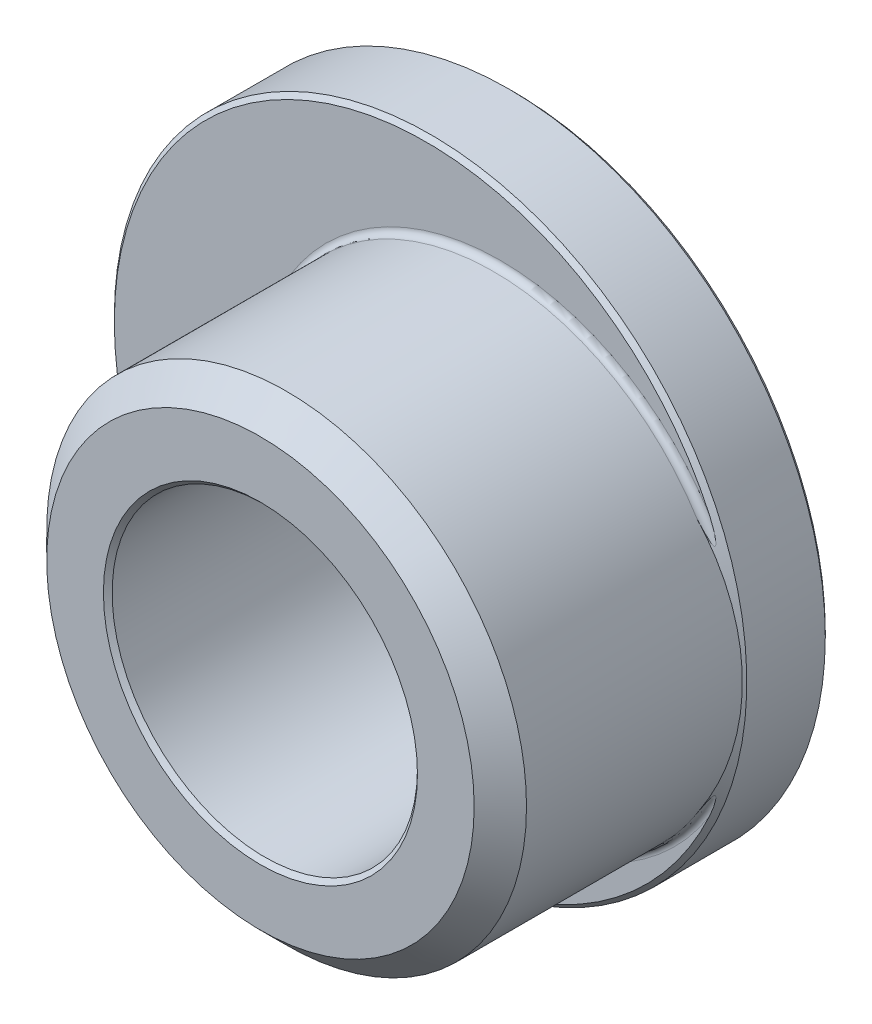
ISO-10303-21;
HEADER;
FILE_DESCRIPTION(('STEP AP214'),'2;1');
FILE_NAME('part.step','',(''),(''),'','','');
FILE_SCHEMA(('AUTOMOTIVE_DESIGN { 1 0 10303 214 1 1 1 1 }'));
ENDSEC;
DATA;
#1=APPLICATION_CONTEXT('core data for automotive mechanical design processes');
#2=APPLICATION_PROTOCOL_DEFINITION('international standard','automotive_design',2000,#1);
#3=PRODUCT_CONTEXT('',#1,'mechanical');
#4=PRODUCT('Part','Part','',(#3));
#5=PRODUCT_RELATED_PRODUCT_CATEGORY('part','',(#4));
#6=PRODUCT_DEFINITION_FORMATION('','',#4);
#7=PRODUCT_DEFINITION_CONTEXT('part definition',#1,'design');
#8=PRODUCT_DEFINITION('design','',#6,#7);
#9=PRODUCT_DEFINITION_SHAPE('','',#8);
#10=(LENGTH_UNIT() NAMED_UNIT(*) SI_UNIT(.MILLI.,.METRE.));
#11=(NAMED_UNIT(*) PLANE_ANGLE_UNIT() SI_UNIT($,.RADIAN.));
#12=(NAMED_UNIT(*) SI_UNIT($,.STERADIAN.) SOLID_ANGLE_UNIT());
#13=UNCERTAINTY_MEASURE_WITH_UNIT(LENGTH_MEASURE(1.E-05),#10,'distance_accuracy_value','');
#14=(GEOMETRIC_REPRESENTATION_CONTEXT(3) GLOBAL_UNCERTAINTY_ASSIGNED_CONTEXT((#13)) GLOBAL_UNIT_ASSIGNED_CONTEXT((#10,
#11,#12)) REPRESENTATION_CONTEXT('',''));
#15=CARTESIAN_POINT('',(0.,0.,0.));
#16=DIRECTION('',(0.,0.,1.));
#17=DIRECTION('',(1.,0.,0.));
#18=AXIS2_PLACEMENT_3D('',#15,#16,#17);
#19=CARTESIAN_POINT('',(0.,0.,15.));
#20=DIRECTION('',(0.,0.,-1.));
#21=DIRECTION('',(-1.,0.,0.));
#22=AXIS2_PLACEMENT_3D('',#19,#20,#21);
#23=CYLINDRICAL_SURFACE('',#22,11.);
#24=CARTESIAN_POINT('',(0.,0.,13.8));
#25=DIRECTION('',(0.,0.,1.));
#26=DIRECTION('',(1.,0.,0.));
#27=AXIS2_PLACEMENT_3D('',#24,#25,#26);
#28=CIRCLE('',#27,11.);
#29=CARTESIAN_POINT('',(11.,0.,13.8));
#30=VERTEX_POINT('',#29);
#31=EDGE_CURVE('E122',#30,#30,#28,.F.);
#32=ORIENTED_EDGE('',*,*,#31,.T.);
#33=EDGE_LOOP('',(#32));
#34=FACE_BOUND('',#33,.T.);
#35=CARTESIAN_POINT('',(9.32941176470587,-5.82769904203775,4.3));
#36=CARTESIAN_POINT('',(9.46506582073713,-5.61056829093484,4.26705682673574));
#37=CARTESIAN_POINT('',(9.59324175545103,-5.38847001269472,4.23604334911613));
#38=CARTESIAN_POINT('',(9.83395815540391,-4.93547805176798,4.17796866420182));
#39=CARTESIAN_POINT('',(9.94649963802059,-4.70458494263273,4.15090719973266));
#40=CARTESIAN_POINT('',(10.1554483381106,-4.2347488021077,4.1007861053484));
#41=CARTESIAN_POINT('',(10.2518301532776,-3.99579379298393,4.07773277398221));
#42=CARTESIAN_POINT('',(10.4276866232475,-3.51137517341966,4.03575413366546));
#43=CARTESIAN_POINT('',(10.5071599730125,-3.26591106223356,4.01682914334775));
#44=CARTESIAN_POINT('',(10.6604894029512,-2.72845736597818,3.98037309527567));
#45=CARTESIAN_POINT('',(10.7312152025437,-2.43551714425476,3.96359680956948));
#46=CARTESIAN_POINT('',(10.8484279736611,-1.84455299415052,3.93582571895308));
#47=CARTESIAN_POINT('',(10.8949136389636,-1.54652879270397,3.92483122560467));
#48=CARTESIAN_POINT('',(10.9632255312275,-0.947815240222858,3.90868319306648));
#49=CARTESIAN_POINT('',(10.9850774645402,-0.647128998113439,3.90352356492783));
#50=CARTESIAN_POINT('',(11.00403133485,-0.0450373079807727,3.89904808334799));
#51=CARTESIAN_POINT('',(11.0011394036638,0.256367943355817,3.89973078211041));
#52=CARTESIAN_POINT('',(10.9647573686512,0.973556078687331,3.90832236300149));
#53=CARTESIAN_POINT('',(10.9199354540887,1.3887806703639,3.91890744960831));
#54=CARTESIAN_POINT('',(10.7835693328883,2.21092487183266,3.95118365558871));
#55=CARTESIAN_POINT('',(10.6920400717163,2.61784709493619,3.97287122238608));
#56=CARTESIAN_POINT('',(10.5072755742107,3.26551710876524,4.01680184023284));
#57=CARTESIAN_POINT('',(10.4279527656208,3.51055648748244,4.03569080711425));
#58=CARTESIAN_POINT('',(10.2524313569832,3.99422282536746,4.07758905757447));
#59=CARTESIAN_POINT('',(10.1562304157966,4.23284888965255,4.10059891276435));
#60=CARTESIAN_POINT('',(9.94736196470939,4.7027861476769,4.1506999465701));
#61=CARTESIAN_POINT('',(9.83466860846366,4.93408515360107,4.17779753342846));
#62=CARTESIAN_POINT('',(9.59361949398408,5.3878149322342,4.23595194978899));
#63=CARTESIAN_POINT('',(9.46526589881345,5.61024692407713,4.2670082325246));
#64=CARTESIAN_POINT('',(9.32941176470585,5.82769904203778,4.3));
#65=B_SPLINE_CURVE_WITH_KNOTS('',3,(#35,#36,#37,#38,#39,#40,#41,#42,#43,#44,#45,#46,#47,#48,#49,
#50,#51,#52,#53,#54,#55,#56,#57,#58,#59,#60,#61,#62,#63,#64),.UNSPECIFIED.,.F.,.F.,(4,2,2,2,2,2,
2,2,2,2,2,2,2,2,4),(0.,0.774242365537738,1.54843432532694,2.32383209775523,3.09928969563251,
4.00366326217738,4.90808555745082,5.81156317321887,6.71481690323679,7.96519206531882,
9.21516738168663,9.98932262964853,10.7635853444687,11.5390747153358,12.3144570930991),.UNSPECIFIED.);
#66=CARTESIAN_POINT('',(9.32941176470587,-5.82769904203775,4.3));
#67=VERTEX_POINT('',#66);
#68=CARTESIAN_POINT('',(9.32941176470585,5.82769904203778,4.3));
#69=VERTEX_POINT('',#68);
#70=EDGE_CURVE('E52',#67,#69,#65,.T.);
#71=ORIENTED_EDGE('',*,*,#70,.T.);
#72=CARTESIAN_POINT('',(0.,0.,4.3));
#73=DIRECTION('',(0.,0.,-1.));
#74=DIRECTION('',(-1.,0.,0.));
#75=AXIS2_PLACEMENT_3D('',#72,#73,#74);
#76=CIRCLE('',#75,11.);
#77=EDGE_CURVE('E67',#69,#67,#76,.F.);
#78=ORIENTED_EDGE('',*,*,#77,.T.);
#79=EDGE_LOOP('',(#71,#78));
#80=FACE_BOUND('',#79,.T.);
#81=ADVANCED_FACE('F33',(#34,#80),#23,.T.);
#82=CARTESIAN_POINT('',(0.,0.,15.));
#83=DIRECTION('',(0.,0.,1.));
#84=DIRECTION('',(1.,0.,0.));
#85=AXIS2_PLACEMENT_3D('',#82,#83,#84);
#86=PLANE('',#85);
#87=CARTESIAN_POINT('',(0.,0.,15.));
#88=DIRECTION('',(0.,0.,1.));
#89=DIRECTION('',(1.,0.,0.));
#90=AXIS2_PLACEMENT_3D('',#87,#88,#89);
#91=CIRCLE('',#90,7.2);
#92=CARTESIAN_POINT('',(7.2,0.,15.));
#93=VERTEX_POINT('',#92);
#94=EDGE_CURVE('E80',#93,#93,#91,.F.);
#95=ORIENTED_EDGE('',*,*,#94,.T.);
#96=EDGE_LOOP('',(#95));
#97=FACE_BOUND('',#96,.T.);
#98=CARTESIAN_POINT('',(0.,0.,15.));
#99=DIRECTION('',(0.,0.,1.));
#100=DIRECTION('',(1.,0.,0.));
#101=AXIS2_PLACEMENT_3D('',#98,#99,#100);
#102=CIRCLE('',#101,9.79999999999998);
#103=CARTESIAN_POINT('',(9.79999999999998,0.,15.));
#104=VERTEX_POINT('',#103);
#105=EDGE_CURVE('E125',#104,#104,#102,.T.);
#106=ORIENTED_EDGE('',*,*,#105,.T.);
#107=EDGE_LOOP('',(#106));
#108=FACE_BOUND('',#107,.T.);
#109=ADVANCED_FACE('F113',(#97,#108),#86,.T.);
#110=CARTESIAN_POINT('',(0.,0.,0.));
#111=DIRECTION('',(0.,0.,1.));
#112=DIRECTION('',(1.,0.,0.));
#113=AXIS2_PLACEMENT_3D('',#110,#111,#112);
#114=PLANE('',#113);
#115=CARTESIAN_POINT('',(-3.4,0.,0.));
#116=DIRECTION('',(0.,0.,1.));
#117=DIRECTION('',(1.,0.,0.));
#118=AXIS2_PLACEMENT_3D('',#115,#116,#117);
#119=CIRCLE('',#118,14.3);
#120=CARTESIAN_POINT('',(10.9,0.,0.));
#121=VERTEX_POINT('',#120);
#122=EDGE_CURVE('E124',#121,#121,#119,.F.);
#123=ORIENTED_EDGE('',*,*,#122,.T.);
#124=EDGE_LOOP('',(#123));
#125=FACE_BOUND('',#124,.T.);
#126=CARTESIAN_POINT('',(0.,0.,0.));
#127=DIRECTION('',(0.,0.,1.));
#128=DIRECTION('',(1.,0.,0.));
#129=AXIS2_PLACEMENT_3D('',#126,#127,#128);
#130=CIRCLE('',#129,8.20000000000002);
#131=CARTESIAN_POINT('',(8.20000000000002,0.,0.));
#132=VERTEX_POINT('',#131);
#133=EDGE_CURVE('E162',#132,#132,#130,.T.);
#134=ORIENTED_EDGE('',*,*,#133,.T.);
#135=EDGE_LOOP('',(#134));
#136=FACE_BOUND('',#135,.T.);
#137=ADVANCED_FACE('F118',(#125,#136),#114,.F.);
#138=CARTESIAN_POINT('',(0.,0.,15.));
#139=DIRECTION('',(0.,0.,-1.));
#140=DIRECTION('',(-1.,0.,0.));
#141=AXIS2_PLACEMENT_3D('',#138,#139,#140);
#142=CYLINDRICAL_SURFACE('',#141,7.);
#143=CARTESIAN_POINT('',(0.,0.,14.8));
#144=DIRECTION('',(0.,0.,1.));
#145=DIRECTION('',(1.,0.,0.));
#146=AXIS2_PLACEMENT_3D('',#143,#144,#145);
#147=CIRCLE('',#146,7.);
#148=CARTESIAN_POINT('',(7.,0.,14.8));
#149=VERTEX_POINT('',#148);
#150=EDGE_CURVE('E76',#149,#149,#147,.T.);
#151=ORIENTED_EDGE('',*,*,#150,.T.);
#152=EDGE_LOOP('',(#151));
#153=FACE_BOUND('',#152,.T.);
#154=CARTESIAN_POINT('',(0.,0.,1.20000000000001));
#155=DIRECTION('',(0.,0.,1.));
#156=DIRECTION('',(1.,0.,0.));
#157=AXIS2_PLACEMENT_3D('',#154,#155,#156);
#158=CIRCLE('',#157,7.);
#159=CARTESIAN_POINT('',(7.,0.,1.20000000000001));
#160=VERTEX_POINT('',#159);
#161=EDGE_CURVE('E130',#160,#160,#158,.F.);
#162=ORIENTED_EDGE('',*,*,#161,.T.);
#163=EDGE_LOOP('',(#162));
#164=FACE_BOUND('',#163,.T.);
#165=ADVANCED_FACE('F148',(#153,#164),#142,.F.);
#166=CARTESIAN_POINT('',(-3.4,0.,4.));
#167=DIRECTION('',(0.,0.,-1.));
#168=DIRECTION('',(-1.,0.,0.));
#169=AXIS2_PLACEMENT_3D('',#166,#167,#168);
#170=PLANE('',#169);
#171=CARTESIAN_POINT('',(-3.4,0.,4.));
#172=DIRECTION('',(0.,0.,-1.));
#173=DIRECTION('',(-1.,0.,0.));
#174=AXIS2_PLACEMENT_3D('',#171,#172,#173);
#175=CIRCLE('',#174,14.3);
#176=CARTESIAN_POINT('',(9.5941176470588,5.97016805244164,4.));
#177=VERTEX_POINT('',#176);
#178=CARTESIAN_POINT('',(9.5941176470588,-5.97016805244164,4.));
#179=VERTEX_POINT('',#178);
#180=EDGE_CURVE('E72',#177,#179,#175,.F.);
#181=ORIENTED_EDGE('',*,*,#180,.T.);
#182=CARTESIAN_POINT('',(0.,0.,4.));
#183=DIRECTION('',(0.,0.,-1.));
#184=DIRECTION('',(-1.,0.,0.));
#185=AXIS2_PLACEMENT_3D('',#182,#183,#184);
#186=CIRCLE('',#185,11.3);
#187=EDGE_CURVE('E66',#179,#177,#186,.T.);
#188=ORIENTED_EDGE('',*,*,#187,.T.);
#189=EDGE_LOOP('',(#181,#188));
#190=FACE_BOUND('',#189,.T.);
#191=ADVANCED_FACE('F71',(#190),#170,.F.);
#192=CARTESIAN_POINT('',(-3.4,0.,4.));
#193=DIRECTION('',(0.,0.,-1.));
#194=DIRECTION('',(-1.,0.,0.));
#195=AXIS2_PLACEMENT_3D('',#192,#193,#194);
#196=CYLINDRICAL_SURFACE('',#195,14.5);
#197=CARTESIAN_POINT('',(-3.4,0.,0.200000000000001));
#198=DIRECTION('',(0.,0.,1.));
#199=DIRECTION('',(1.,0.,0.));
#200=AXIS2_PLACEMENT_3D('',#197,#198,#199);
#201=CIRCLE('',#200,14.5);
#202=CARTESIAN_POINT('',(11.1,0.,0.200000000000001));
#203=VERTEX_POINT('',#202);
#204=EDGE_CURVE('E77',#203,#203,#201,.T.);
#205=ORIENTED_EDGE('',*,*,#204,.T.);
#206=EDGE_LOOP('',(#205));
#207=FACE_BOUND('',#206,.T.);
#208=CARTESIAN_POINT('',(-3.4,0.,3.8));
#209=DIRECTION('',(0.,0.,-1.));
#210=DIRECTION('',(-1.,0.,0.));
#211=AXIS2_PLACEMENT_3D('',#208,#209,#210);
#212=CIRCLE('',#211,14.5);
#213=CARTESIAN_POINT('',(-17.9,0.,3.8));
#214=VERTEX_POINT('',#213);
#215=EDGE_CURVE('E83',#214,#214,#212,.T.);
#216=ORIENTED_EDGE('',*,*,#215,.T.);
#217=EDGE_LOOP('',(#216));
#218=FACE_BOUND('',#217,.T.);
#219=ADVANCED_FACE('F136',(#207,#218),#196,.T.);
#220=CARTESIAN_POINT('',(0.,0.,0.));
#221=DIRECTION('',(0.,0.,-1.));
#222=DIRECTION('',(-1.,0.,0.));
#223=AXIS2_PLACEMENT_3D('',#220,#221,#222);
#224=CONICAL_SURFACE('',#223,8.20000000000002,0.785398163397453);
#225=ORIENTED_EDGE('',*,*,#161,.F.);
#226=EDGE_LOOP('',(#225));
#227=FACE_BOUND('',#226,.T.);
#228=ORIENTED_EDGE('',*,*,#133,.F.);
#229=EDGE_LOOP('',(#228));
#230=FACE_BOUND('',#229,.T.);
#231=ADVANCED_FACE('F138',(#227,#230),#224,.F.);
#232=CARTESIAN_POINT('',(0.,0.,15.));
#233=DIRECTION('',(0.,0.,-1.));
#234=DIRECTION('',(-1.,0.,0.));
#235=AXIS2_PLACEMENT_3D('',#232,#233,#234);
#236=CONICAL_SURFACE('',#235,9.79999999999998,0.785398163397453);
#237=ORIENTED_EDGE('',*,*,#31,.F.);
#238=EDGE_LOOP('',(#237));
#239=FACE_BOUND('',#238,.T.);
#240=ORIENTED_EDGE('',*,*,#105,.F.);
#241=EDGE_LOOP('',(#240));
#242=FACE_BOUND('',#241,.T.);
#243=ADVANCED_FACE('F145',(#239,#242),#236,.T.);
#244=CARTESIAN_POINT('',(-3.4,0.,0.));
#245=DIRECTION('',(0.,0.,1.));
#246=DIRECTION('',(1.,0.,0.));
#247=AXIS2_PLACEMENT_3D('',#244,#245,#246);
#248=CONICAL_SURFACE('',#247,14.3,0.785398163397459);
#249=ORIENTED_EDGE('',*,*,#204,.F.);
#250=EDGE_LOOP('',(#249));
#251=FACE_BOUND('',#250,.T.);
#252=ORIENTED_EDGE('',*,*,#122,.F.);
#253=EDGE_LOOP('',(#252));
#254=FACE_BOUND('',#253,.T.);
#255=ADVANCED_FACE('F98',(#251,#254),#248,.T.);
#256=CARTESIAN_POINT('',(-3.4,0.,3.8));
#257=DIRECTION('',(0.,0.,-1.));
#258=DIRECTION('',(-1.,0.,0.));
#259=AXIS2_PLACEMENT_3D('',#256,#257,#258);
#260=CONICAL_SURFACE('',#259,14.5,0.785398163397445);
#261=ORIENTED_EDGE('',*,*,#70,.F.);
#262=CARTESIAN_POINT('',(9.32941176470587,-5.82769904203775,4.3));
#263=CARTESIAN_POINT('',(9.35567432823292,-5.78566719086998,4.29361747956263));
#264=CARTESIAN_POINT('',(9.38180805367118,-5.7435721494419,4.2871192083777));
#265=CARTESIAN_POINT('',(9.43388513445819,-5.65931002878486,4.27381055955016));
#266=CARTESIAN_POINT('',(9.459828477787,-5.61714294521118,4.26700016239459));
#267=CARTESIAN_POINT('',(9.5116251021872,-5.53273725001009,4.25297761562797));
#268=CARTESIAN_POINT('',(9.53747820606326,-5.49049862096512,4.24576491630236));
#269=CARTESIAN_POINT('',(9.58917264913288,-5.40610804544481,4.23080603584408));
#270=CARTESIAN_POINT('',(9.61501398853523,-5.36395609738038,4.22305986458271));
#271=CARTESIAN_POINT('',(9.66307429534961,-5.28613390407775,4.20796688018542));
#272=CARTESIAN_POINT('',(9.68526514690786,-5.25042498115918,4.20072978601695));
#273=CARTESIAN_POINT('',(9.73004142575986,-5.17944089383996,4.18536582503675));
#274=CARTESIAN_POINT('',(9.7526268109982,-5.14416568388236,4.17723905257996));
#275=CARTESIAN_POINT('',(9.78636824429276,-5.09348048886798,4.16410601051457));
#276=CARTESIAN_POINT('',(9.79711314117763,-5.07762544782599,4.15978316848201));
#277=CARTESIAN_POINT('',(9.81897060293627,-5.04634538181946,4.15056738626637));
#278=CARTESIAN_POINT('',(9.83008305614069,-5.03092022882533,4.14567461811702));
#279=CARTESIAN_POINT('',(9.84933910179881,-5.00570404894436,4.13659965740688));
#280=CARTESIAN_POINT('',(9.85729726853871,-4.99568712855493,4.1326896656627));
#281=CARTESIAN_POINT('',(9.87133862406301,-4.97934674524824,4.12529537155598));
#282=CARTESIAN_POINT('',(9.87728651756075,-4.97280218495436,4.12202298958757));
#283=CARTESIAN_POINT('',(9.88990219609609,-4.96024128309721,4.11460505183379));
#284=CARTESIAN_POINT('',(9.89658825600877,-4.95425267106034,4.1104321552611));
#285=CARTESIAN_POINT('',(9.90502913023575,-4.94889056537332,4.10439095925039));
#286=CARTESIAN_POINT('',(9.90642007581453,-4.94807308035141,4.10337219624035));
#287=CARTESIAN_POINT('',(9.9092314406055,-4.94661071116358,4.10124661283734));
#288=CARTESIAN_POINT('',(9.91065190400387,-4.94596610938337,4.10013965216186));
#289=CARTESIAN_POINT('',(9.91352710799037,-4.94490734177039,4.09781313836957));
#290=CARTESIAN_POINT('',(9.91498204906239,-4.94449657108442,4.09659221193939));
#291=CARTESIAN_POINT('',(9.91786484449757,-4.9440204254359,4.09405541870199));
#292=CARTESIAN_POINT('',(9.91929278777858,-4.94395358811992,4.09273997801153));
#293=CARTESIAN_POINT('',(9.92160345715735,-4.94420814884052,4.09048513009433));
#294=CARTESIAN_POINT('',(9.92251378516046,-4.94441155444026,4.08956090834659));
#295=CARTESIAN_POINT('',(9.92425717190319,-4.94503127039394,4.08771083021195));
#296=CARTESIAN_POINT('',(9.92509027561013,-4.94544745591551,4.08678497510032));
#297=CARTESIAN_POINT('',(9.92665274991983,-4.94647935805872,4.08496107936379));
#298=CARTESIAN_POINT('',(9.92738227947749,-4.94709476406954,4.08406299780886));
#299=CARTESIAN_POINT('',(9.92872901924108,-4.94849253659545,4.08231399008215));
#300=CARTESIAN_POINT('',(9.92934610647952,-4.94927508389033,4.08146311623562));
#301=CARTESIAN_POINT('',(9.93075378827622,-4.95139340117482,4.07940604666812));
#302=CARTESIAN_POINT('',(9.93147569098161,-4.95280953567842,4.07823622081406));
#303=CARTESIAN_POINT('',(9.93271414300581,-4.95582081599285,4.076026401701));
#304=CARTESIAN_POINT('',(9.93323008069654,-4.95741647719938,4.07498680133715));
#305=CARTESIAN_POINT('',(9.93451522757787,-4.96226526387857,4.07209201143868));
#306=CARTESIAN_POINT('',(9.93506581674125,-4.96566495651828,4.07039005065915));
#307=CARTESIAN_POINT('',(9.93579680145278,-4.97262828098816,4.06727369121253));
#308=CARTESIAN_POINT('',(9.93597594636109,-4.97619242548919,4.06586027842711));
#309=CARTESIAN_POINT('',(9.93628690842221,-4.99298062645352,4.0596960725631));
#310=CARTESIAN_POINT('',(9.93501845593768,-5.00661808789713,4.05609713289333));
#311=CARTESIAN_POINT('',(9.93142749877905,-5.03395151514847,4.04982668063639));
#312=CARTESIAN_POINT('',(9.92909788934851,-5.04764724869705,4.04716163706481));
#313=CARTESIAN_POINT('',(9.92124148490793,-5.08837428771321,4.04004564980025));
#314=CARTESIAN_POINT('',(9.91481260920426,-5.11538240513336,4.03638840625674));
#315=CARTESIAN_POINT('',(9.90082069266033,-5.16922213338519,4.03003441618133));
#316=CARTESIAN_POINT('',(9.89325548823205,-5.19605330331184,4.02733953579827));
#317=CARTESIAN_POINT('',(9.87735185345406,-5.24949548379582,4.02258754027925));
#318=CARTESIAN_POINT('',(9.86901484855297,-5.27610680511289,4.02052927873417));
#319=CARTESIAN_POINT('',(9.85176683461787,-5.32914267777771,4.01685218441414));
#320=CARTESIAN_POINT('',(9.8428563316677,-5.35556737156628,4.01523297060526));
#321=CARTESIAN_POINT('',(9.81629655330478,-5.43208010847618,4.01101198701236));
#322=CARTESIAN_POINT('',(9.79802562282611,-5.48197694719698,4.0088442812785));
#323=CARTESIAN_POINT('',(9.76015171719905,-5.58131739908376,4.00532016195764));
#324=CARTESIAN_POINT('',(9.74054797823135,-5.63076073361504,4.00396421802264));
#325=CARTESIAN_POINT('',(9.70036854725989,-5.72880245342206,4.00188645539429));
#326=CARTESIAN_POINT('',(9.67980185866661,-5.77740443277157,4.00115966327617));
#327=CARTESIAN_POINT('',(9.63767892176395,-5.87413032105172,4.00022036240314));
#328=CARTESIAN_POINT('',(9.61612359634761,-5.92225462681199,4.00000738357411));
#329=CARTESIAN_POINT('',(9.59411764707315,-5.97016805244581,3.99999999998523));
#330=B_SPLINE_CURVE_WITH_KNOTS('',3,(#262,#263,#264,#265,#266,#267,#268,#269,#270,#271,#272,
#273,#274,#275,#276,#277,#278,#279,#280,#281,#282,#283,#284,#285,#286,#287,#288,#289,#290,#291,
#292,#293,#294,#295,#296,#297,#298,#299,#300,#301,#302,#303,#304,#305,#306,#307,#308,#309,#310,
#311,#312,#313,#314,#315,#316,#317,#318,#319,#320,#321,#322,#323,#324,#325,#326,#327,#328,#329),
.UNSPECIFIED.,.F.,.F.,(4,2,2,2,2,2,2,2,2,2,2,2,2,2,2,2,2,2,2,2,2,2,2,2,2,2,2,2,2,2,2,2,2,4),(0.,
0.149914125134423,0.299837635162152,0.449971276889625,0.600102141309398,0.728081010073283,
0.85604631914943,0.914939050589873,0.97381405094404,1.01388397971222,1.04219242545945,
1.07152653385014,1.07724272564339,1.08296819811577,1.08877481067529,1.09455671386302,
1.09847834135494,1.1023976707672,1.10631091862769,1.11022842068195,1.11611500151469,
1.12201893521475,1.13347925591411,1.14497810086548,1.18714217143702,1.22959278911442,
1.31345136759428,1.39747168701741,1.48133981156536,1.56513491527205,1.72463972762238,
1.88423673393628,2.04256029882763,2.20073896267703),.UNSPECIFIED.);
#331=EDGE_CURVE('E11',#67,#179,#330,.T.);
#332=ORIENTED_EDGE('',*,*,#331,.T.);
#333=ORIENTED_EDGE('',*,*,#180,.F.);
#334=CARTESIAN_POINT('',(9.5941176470588,5.97016805244164,4.));
#335=CARTESIAN_POINT('',(9.61517111963106,5.92433181317471,4.00000561770866));
#336=CARTESIAN_POINT('',(9.63581013152861,5.87830252249405,4.00020134572311));
#337=CARTESIAN_POINT('',(9.67618251933939,5.78582054897832,4.00105869557503));
#338=CARTESIAN_POINT('',(9.69591534804231,5.73936763010435,4.00172059507574));
#339=CARTESIAN_POINT('',(9.73407829564281,5.64677161590425,4.00358176921148));
#340=CARTESIAN_POINT('',(9.75252375731957,5.60063470322634,4.0047726426345));
#341=CARTESIAN_POINT('',(9.78827874454996,5.50796254961336,4.00783836557314));
#342=CARTESIAN_POINT('',(9.8055886668315,5.46142745428566,4.00971297469153));
#343=CARTESIAN_POINT('',(9.83886821885639,5.36777778101521,4.01440583161057));
#344=CARTESIAN_POINT('',(9.85483415162588,5.32066198875547,4.01722658229907));
#345=CARTESIAN_POINT('',(9.87736477951263,5.2493193661211,4.02263535746674));
#346=CARTESIAN_POINT('',(9.88467612064321,5.22528817526417,4.02464946191194));
#347=CARTESIAN_POINT('',(9.89858589164129,5.17711146775896,4.02925207352824));
#348=CARTESIAN_POINT('',(9.90518521015656,5.15296613381369,4.03183985209624));
#349=CARTESIAN_POINT('',(9.91743489914455,5.10426337975313,4.03791902030365));
#350=CARTESIAN_POINT('',(9.92307571430525,5.07970422159704,4.04141871671271));
#351=CARTESIAN_POINT('',(9.92989125220122,5.04297641995762,4.04807163113819));
#352=CARTESIAN_POINT('',(9.93188173806551,5.03082447749543,4.05050456179818));
#353=CARTESIAN_POINT('',(9.93496696223535,5.00659641151382,4.05615169509994));
#354=CARTESIAN_POINT('',(9.93606700081248,4.99452027034552,4.05936112490054));
#355=CARTESIAN_POINT('',(9.93606561590122,4.97953665996944,4.06460671312646));
#356=CARTESIAN_POINT('',(9.93598360785561,4.9763511115231,4.06579750093361));
#357=CARTESIAN_POINT('',(9.93557098034716,4.9700737422459,4.0683775238014));
#358=CARTESIAN_POINT('',(9.93524051617238,4.96698186412515,4.06976663446871));
#359=CARTESIAN_POINT('',(9.93439234349338,4.96205180083503,4.07228147895633));
#360=CARTESIAN_POINT('',(9.93398157969034,4.9601556072572,4.07332765379558));
#361=CARTESIAN_POINT('',(9.93295148048878,4.95650778181352,4.0755646066462));
#362=CARTESIAN_POINT('',(9.93233246989607,4.95475593008038,4.0767551576337));
#363=CARTESIAN_POINT('',(9.9310628065604,4.95202361923377,4.0788969229884));
#364=CARTESIAN_POINT('',(9.93048508635959,4.95097523246772,4.07980351993551));
#365=CARTESIAN_POINT('',(9.92918575898681,4.94904921445487,4.08169206031912));
#366=CARTESIAN_POINT('',(9.92846439373856,4.9481713009458,4.08267387538715));
#367=CARTESIAN_POINT('',(9.92686467374527,4.94663490731058,4.08470827829781));
#368=CARTESIAN_POINT('',(9.92598462764325,4.94597903502679,4.08576154377761));
#369=CARTESIAN_POINT('',(9.92409692694747,4.94494647286588,4.08789056789171));
#370=CARTESIAN_POINT('',(9.92308930244934,4.94456971728852,4.08896632117135));
#371=CARTESIAN_POINT('',(9.9211444277575,4.9441313243824,4.09094220539369));
#372=CARTESIAN_POINT('',(9.92021808514716,4.94403198449538,4.09184522895495));
#373=CARTESIAN_POINT('',(9.91833325308077,4.94401645235731,4.09361765905002));
#374=CARTESIAN_POINT('',(9.91737474742538,4.94410035380396,4.09448704815402));
#375=CARTESIAN_POINT('',(9.91477966122232,4.94453175853514,4.09676969556695));
#376=CARTESIAN_POINT('',(9.91313252291005,4.94502142319659,4.09814332146584));
#377=CARTESIAN_POINT('',(9.90985758618117,4.94630352900467,4.10076670546244));
#378=CARTESIAN_POINT('',(9.90822987561777,4.947097023736,4.10201601325594));
#379=CARTESIAN_POINT('',(9.90242556162002,4.95031898091222,4.10633342223677));
#380=CARTESIAN_POINT('',(9.89835572268664,4.9533258965828,4.10909857819762));
#381=CARTESIAN_POINT('',(9.89043796899566,4.95992803199626,4.11421110350343));
#382=CARTESIAN_POINT('',(9.88659180682886,4.96352722194019,4.11655541334135));
#383=CARTESIAN_POINT('',(9.87525187405716,4.9748478019145,4.12321160098394));
#384=CARTESIAN_POINT('',(9.8680055497204,4.98305492092917,4.12711387957247));
#385=CARTESIAN_POINT('',(9.85387072169208,5.00000969729827,4.13436992573941));
#386=CARTESIAN_POINT('',(9.84698336383963,5.00875891116426,4.13772200246163));
#387=CARTESIAN_POINT('',(9.82666169494329,5.03547126205857,4.1472584978629));
#388=CARTESIAN_POINT('',(9.81357783799454,5.0538875880135,4.15291779908546));
#389=CARTESIAN_POINT('',(9.77529167363311,5.10940377582587,4.1687431178374));
#390=CARTESIAN_POINT('',(9.75072543296825,5.14719542460586,4.17791662670753));
#391=CARTESIAN_POINT('',(9.70214212048751,5.2234439181544,4.19508893289042));
#392=CARTESIAN_POINT('',(9.67812578929189,5.2619015500725,4.20308621656494));
#393=CARTESIAN_POINT('',(9.63036929603566,5.33900919706852,4.21832573727261));
#394=CARTESIAN_POINT('',(9.60662862268581,5.37765855917795,4.22556968228239));
#395=CARTESIAN_POINT('',(9.55918490627724,5.45504357758068,4.23956035524914));
#396=CARTESIAN_POINT('',(9.53548185090648,5.4937791858021,4.24630731119122));
#397=CARTESIAN_POINT('',(9.48156821300621,5.58174958572763,4.26121569175396));
#398=CARTESIAN_POINT('',(9.4513329148713,5.63098810579412,4.26926562474245));
#399=CARTESIAN_POINT('',(9.39059644077919,5.7294146526799,4.28492734622708));
#400=CARTESIAN_POINT('',(9.36009510871171,5.77860262784501,4.29253885430081));
#401=CARTESIAN_POINT('',(9.32941176470585,5.82769904203778,4.30000000000001));
#402=B_SPLINE_CURVE_WITH_KNOTS('',3,(#334,#335,#336,#337,#338,#339,#340,#341,#342,#343,#344,
#345,#346,#347,#348,#349,#350,#351,#352,#353,#354,#355,#356,#357,#358,#359,#360,#361,#362,#363,
#364,#365,#366,#367,#368,#369,#370,#371,#372,#373,#374,#375,#376,#377,#378,#379,#380,#381,#382,
#383,#384,#385,#386,#387,#388,#389,#390,#391,#392,#393,#394,#395,#396,#397,#398,#399,#400,#401),
.UNSPECIFIED.,.F.,.F.,(4,2,2,2,2,2,2,2,2,2,2,2,2,2,2,2,2,2,2,2,2,2,2,2,2,2,2,2,2,2,2,2,2,4),(0.,
0.151321602991512,0.302733413171578,0.451821990012545,0.600858198683625,0.750291813071917,
0.825874685028553,0.901362106301058,0.977562772433153,1.01521646427945,1.05264434437376,
1.06284007258691,1.07302943363881,1.07962998352293,1.08622028579005,1.09071063798751,
1.09519349064197,1.09972730192463,1.10426004567105,1.10813704457617,1.11201602639068,
1.1185773254332,1.12516158607211,1.14232517223191,1.1596088849996,1.19438288826778,
1.22926183380835,1.29906815626681,1.43700704244757,1.57512191219075,1.7129164875992,
1.85064745332325,2.0256610567711,2.20078538582947),.UNSPECIFIED.);
#403=EDGE_CURVE('E46',#177,#69,#402,.T.);
#404=ORIENTED_EDGE('',*,*,#403,.T.);
#405=EDGE_LOOP('',(#261,#332,#333,#404));
#406=FACE_BOUND('',#405,.T.);
#407=ORIENTED_EDGE('',*,*,#215,.F.);
#408=EDGE_LOOP('',(#407));
#409=FACE_BOUND('',#408,.T.);
#410=ADVANCED_FACE('F74',(#406,#409),#260,.T.);
#411=CARTESIAN_POINT('',(0.,0.,14.8));
#412=DIRECTION('',(0.,0.,1.));
#413=DIRECTION('',(1.,0.,0.));
#414=AXIS2_PLACEMENT_3D('',#411,#412,#413);
#415=CONICAL_SURFACE('',#414,7.,0.785398163397442);
#416=ORIENTED_EDGE('',*,*,#94,.F.);
#417=EDGE_LOOP('',(#416));
#418=FACE_BOUND('',#417,.T.);
#419=ORIENTED_EDGE('',*,*,#150,.F.);
#420=EDGE_LOOP('',(#419));
#421=FACE_BOUND('',#420,.T.);
#422=ADVANCED_FACE('F97',(#418,#421),#415,.F.);
#423=CARTESIAN_POINT('',(0.,0.,4.3));
#424=DIRECTION('',(0.,0.,-1.));
#425=DIRECTION('',(-1.,0.,0.));
#426=AXIS2_PLACEMENT_3D('',#423,#424,#425);
#427=TOROIDAL_SURFACE('',#426,11.3,0.3);
#428=ORIENTED_EDGE('',*,*,#331,.F.);
#429=ORIENTED_EDGE('',*,*,#77,.F.);
#430=ORIENTED_EDGE('',*,*,#403,.F.);
#431=ORIENTED_EDGE('',*,*,#187,.F.);
#432=EDGE_LOOP('',(#428,#429,#430,#431));
#433=FACE_BOUND('',#432,.T.);
#434=ADVANCED_FACE('F65',(#433),#427,.F.);
#435=CLOSED_SHELL('',(#81,#109,#137,#165,#191,#219,#231,#243,#255,#410,#422,#434));
#436=MANIFOLD_SOLID_BREP('B2',#435);
#437=ADVANCED_BREP_SHAPE_REPRESENTATION('',(#18,#436),#14);
#438=SHAPE_DEFINITION_REPRESENTATION(#9,#437);
ENDSEC;
END-ISO-10303-21;
